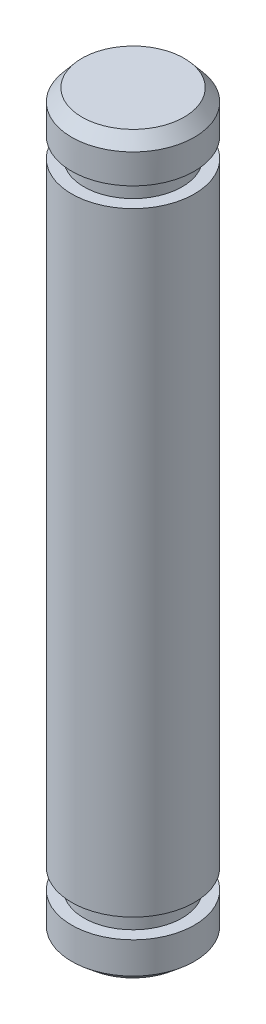
ISO-10303-21;
HEADER;
FILE_DESCRIPTION(('STEP AP214'),'2;1');
FILE_NAME('part.step','',(''),(''),'','','');
FILE_SCHEMA(('AUTOMOTIVE_DESIGN { 1 0 10303 214 1 1 1 1 }'));
ENDSEC;
DATA;
#1=APPLICATION_CONTEXT('core data for automotive mechanical design processes');
#2=APPLICATION_PROTOCOL_DEFINITION('international standard','automotive_design',2000,#1);
#3=PRODUCT_CONTEXT('',#1,'mechanical');
#4=PRODUCT('Part','Part','',(#3));
#5=PRODUCT_RELATED_PRODUCT_CATEGORY('part','',(#4));
#6=PRODUCT_DEFINITION_FORMATION('','',#4);
#7=PRODUCT_DEFINITION_CONTEXT('part definition',#1,'design');
#8=PRODUCT_DEFINITION('design','',#6,#7);
#9=PRODUCT_DEFINITION_SHAPE('','',#8);
#10=(LENGTH_UNIT() NAMED_UNIT(*) SI_UNIT(.MILLI.,.METRE.));
#11=(NAMED_UNIT(*) PLANE_ANGLE_UNIT() SI_UNIT($,.RADIAN.));
#12=(NAMED_UNIT(*) SI_UNIT($,.STERADIAN.) SOLID_ANGLE_UNIT());
#13=UNCERTAINTY_MEASURE_WITH_UNIT(LENGTH_MEASURE(1.E-05),#10,'distance_accuracy_value','');
#14=(GEOMETRIC_REPRESENTATION_CONTEXT(3) GLOBAL_UNCERTAINTY_ASSIGNED_CONTEXT((#13)) GLOBAL_UNIT_ASSIGNED_CONTEXT((#10,
#11,#12)) REPRESENTATION_CONTEXT('',''));
#15=CARTESIAN_POINT('',(0.,0.,0.));
#16=DIRECTION('',(0.,0.,1.));
#17=DIRECTION('',(1.,0.,0.));
#18=AXIS2_PLACEMENT_3D('',#15,#16,#17);
#19=CARTESIAN_POINT('',(0.,15.,0.));
#20=DIRECTION('',(0.,-1.,0.));
#21=DIRECTION('',(0.,0.,-1.));
#22=AXIS2_PLACEMENT_3D('',#19,#20,#21);
#23=CYLINDRICAL_SURFACE('',#22,2.5);
#24=CARTESIAN_POINT('',(0.,14.5,0.));
#25=DIRECTION('',(0.,1.,0.));
#26=DIRECTION('',(0.,0.,1.));
#27=AXIS2_PLACEMENT_3D('',#24,#25,#26);
#28=CIRCLE('',#27,2.5);
#29=CARTESIAN_POINT('',(0.,14.5,2.5));
#30=VERTEX_POINT('',#29);
#31=EDGE_CURVE('E51',#30,#30,#28,.F.);
#32=ORIENTED_EDGE('',*,*,#31,.T.);
#33=EDGE_LOOP('',(#32));
#34=FACE_BOUND('',#33,.T.);
#35=CARTESIAN_POINT('',(0.,13.3,0.));
#36=DIRECTION('',(0.,-1.,0.));
#37=DIRECTION('',(0.,0.,-1.));
#38=AXIS2_PLACEMENT_3D('',#35,#36,#37);
#39=CIRCLE('',#38,2.5);
#40=CARTESIAN_POINT('',(0.,13.3,-2.5));
#41=VERTEX_POINT('',#40);
#42=EDGE_CURVE('E60',#41,#41,#39,.T.);
#43=ORIENTED_EDGE('',*,*,#42,.F.);
#44=EDGE_LOOP('',(#43));
#45=FACE_BOUND('',#44,.T.);
#46=ADVANCED_FACE('F39',(#34,#45),#23,.T.);
#47=CARTESIAN_POINT('',(0.,15.,0.));
#48=DIRECTION('',(0.,1.,0.));
#49=DIRECTION('',(0.,0.,1.));
#50=AXIS2_PLACEMENT_3D('',#47,#48,#49);
#51=PLANE('',#50);
#52=CARTESIAN_POINT('',(0.,15.,0.));
#53=DIRECTION('',(0.,1.,0.));
#54=DIRECTION('',(0.,0.,1.));
#55=AXIS2_PLACEMENT_3D('',#52,#53,#54);
#56=CIRCLE('',#55,2.08045018441136);
#57=CARTESIAN_POINT('',(0.,15.,2.08045018441136));
#58=VERTEX_POINT('',#57);
#59=EDGE_CURVE('E55',#58,#58,#56,.T.);
#60=ORIENTED_EDGE('',*,*,#59,.T.);
#61=EDGE_LOOP('',(#60));
#62=FACE_BOUND('',#61,.T.);
#63=ADVANCED_FACE('F106',(#62),#51,.T.);
#64=CARTESIAN_POINT('',(0.,13.3,0.));
#65=DIRECTION('',(0.,-1.,0.));
#66=DIRECTION('',(0.,0.,-1.));
#67=AXIS2_PLACEMENT_3D('',#64,#65,#66);
#68=PLANE('',#67);
#69=CARTESIAN_POINT('',(0.,13.3,0.));
#70=DIRECTION('',(0.,-1.,0.));
#71=DIRECTION('',(0.,0.,-1.));
#72=AXIS2_PLACEMENT_3D('',#69,#70,#71);
#73=CIRCLE('',#72,2.);
#74=CARTESIAN_POINT('',(0.,13.3,-2.));
#75=VERTEX_POINT('',#74);
#76=EDGE_CURVE('E64',#75,#75,#73,.T.);
#77=ORIENTED_EDGE('',*,*,#76,.F.);
#78=EDGE_LOOP('',(#77));
#79=FACE_BOUND('',#78,.T.);
#80=ORIENTED_EDGE('',*,*,#42,.T.);
#81=EDGE_LOOP('',(#80));
#82=FACE_BOUND('',#81,.T.);
#83=ADVANCED_FACE('F113',(#79,#82),#68,.T.);
#84=CARTESIAN_POINT('',(0.,12.5,0.));
#85=DIRECTION('',(0.,-1.,0.));
#86=DIRECTION('',(0.,0.,-1.));
#87=AXIS2_PLACEMENT_3D('',#84,#85,#86);
#88=PLANE('',#87);
#89=CARTESIAN_POINT('',(0.,12.5,0.));
#90=DIRECTION('',(0.,-1.,0.));
#91=DIRECTION('',(0.,0.,-1.));
#92=AXIS2_PLACEMENT_3D('',#89,#90,#91);
#93=CIRCLE('',#92,2.);
#94=CARTESIAN_POINT('',(0.,12.5,-2.));
#95=VERTEX_POINT('',#94);
#96=EDGE_CURVE('E67',#95,#95,#93,.T.);
#97=ORIENTED_EDGE('',*,*,#96,.T.);
#98=EDGE_LOOP('',(#97));
#99=FACE_BOUND('',#98,.T.);
#100=CARTESIAN_POINT('',(0.,12.5,0.));
#101=DIRECTION('',(0.,-1.,0.));
#102=DIRECTION('',(0.,0.,-1.));
#103=AXIS2_PLACEMENT_3D('',#100,#101,#102);
#104=CIRCLE('',#103,2.5);
#105=CARTESIAN_POINT('',(0.,12.5,-2.5));
#106=VERTEX_POINT('',#105);
#107=EDGE_CURVE('E61',#106,#106,#104,.T.);
#108=ORIENTED_EDGE('',*,*,#107,.F.);
#109=EDGE_LOOP('',(#108));
#110=FACE_BOUND('',#109,.T.);
#111=ADVANCED_FACE('F134',(#99,#110),#88,.F.);
#112=CARTESIAN_POINT('',(0.,13.3,0.));
#113=DIRECTION('',(0.,-1.,0.));
#114=DIRECTION('',(0.,0.,-1.));
#115=AXIS2_PLACEMENT_3D('',#112,#113,#114);
#116=CYLINDRICAL_SURFACE('',#115,2.);
#117=ORIENTED_EDGE('',*,*,#76,.T.);
#118=EDGE_LOOP('',(#117));
#119=FACE_BOUND('',#118,.T.);
#120=ORIENTED_EDGE('',*,*,#96,.F.);
#121=EDGE_LOOP('',(#120));
#122=FACE_BOUND('',#121,.T.);
#123=ADVANCED_FACE('F118',(#119,#122),#116,.T.);
#124=CARTESIAN_POINT('',(0.,-12.5,0.));
#125=DIRECTION('',(0.,-1.,0.));
#126=DIRECTION('',(0.,0.,-1.));
#127=AXIS2_PLACEMENT_3D('',#124,#125,#126);
#128=CIRCLE('',#127,2.5);
#129=CARTESIAN_POINT('',(0.,-12.5,-2.5));
#130=VERTEX_POINT('',#129);
#131=EDGE_CURVE('E73',#130,#130,#128,.T.);
#132=ORIENTED_EDGE('',*,*,#131,.F.);
#133=EDGE_LOOP('',(#132));
#134=FACE_BOUND('',#133,.T.);
#135=ORIENTED_EDGE('',*,*,#107,.T.);
#136=EDGE_LOOP('',(#135));
#137=FACE_BOUND('',#136,.T.);
#138=ADVANCED_FACE('F101',(#134,#137),#23,.T.);
#139=CARTESIAN_POINT('',(0.,-13.3,0.));
#140=DIRECTION('',(0.,1.,0.));
#141=DIRECTION('',(0.,0.,-1.));
#142=AXIS2_PLACEMENT_3D('',#139,#140,#141);
#143=PLANE('',#142);
#144=CARTESIAN_POINT('',(0.,-13.3,0.));
#145=DIRECTION('',(0.,-1.,0.));
#146=DIRECTION('',(0.,0.,-1.));
#147=AXIS2_PLACEMENT_3D('',#144,#145,#146);
#148=CIRCLE('',#147,2.5);
#149=CARTESIAN_POINT('',(0.,-13.3,-2.5));
#150=VERTEX_POINT('',#149);
#151=EDGE_CURVE('E70',#150,#150,#148,.T.);
#152=ORIENTED_EDGE('',*,*,#151,.F.);
#153=EDGE_LOOP('',(#152));
#154=FACE_BOUND('',#153,.T.);
#155=CARTESIAN_POINT('',(0.,-13.3,0.));
#156=DIRECTION('',(0.,-1.,0.));
#157=DIRECTION('',(0.,0.,-1.));
#158=AXIS2_PLACEMENT_3D('',#155,#156,#157);
#159=CIRCLE('',#158,2.);
#160=CARTESIAN_POINT('',(0.,-13.3,-2.));
#161=VERTEX_POINT('',#160);
#162=EDGE_CURVE('E76',#161,#161,#159,.T.);
#163=ORIENTED_EDGE('',*,*,#162,.T.);
#164=EDGE_LOOP('',(#163));
#165=FACE_BOUND('',#164,.T.);
#166=ADVANCED_FACE('F85',(#154,#165),#143,.T.);
#167=CARTESIAN_POINT('',(0.,-12.5,0.));
#168=DIRECTION('',(0.,1.,0.));
#169=DIRECTION('',(0.,0.,-1.));
#170=AXIS2_PLACEMENT_3D('',#167,#168,#169);
#171=PLANE('',#170);
#172=ORIENTED_EDGE('',*,*,#131,.T.);
#173=EDGE_LOOP('',(#172));
#174=FACE_BOUND('',#173,.T.);
#175=CARTESIAN_POINT('',(0.,-12.5,0.));
#176=DIRECTION('',(0.,-1.,0.));
#177=DIRECTION('',(0.,0.,-1.));
#178=AXIS2_PLACEMENT_3D('',#175,#176,#177);
#179=CIRCLE('',#178,2.);
#180=CARTESIAN_POINT('',(0.,-12.5,-2.));
#181=VERTEX_POINT('',#180);
#182=EDGE_CURVE('E79',#181,#181,#179,.T.);
#183=ORIENTED_EDGE('',*,*,#182,.F.);
#184=EDGE_LOOP('',(#183));
#185=FACE_BOUND('',#184,.T.);
#186=ADVANCED_FACE('F91',(#174,#185),#171,.F.);
#187=CARTESIAN_POINT('',(0.,-13.3,0.));
#188=DIRECTION('',(0.,1.,0.));
#189=DIRECTION('',(0.,0.,1.));
#190=AXIS2_PLACEMENT_3D('',#187,#188,#189);
#191=CYLINDRICAL_SURFACE('',#190,2.);
#192=ORIENTED_EDGE('',*,*,#162,.F.);
#193=EDGE_LOOP('',(#192));
#194=FACE_BOUND('',#193,.T.);
#195=ORIENTED_EDGE('',*,*,#182,.T.);
#196=EDGE_LOOP('',(#195));
#197=FACE_BOUND('',#196,.T.);
#198=ADVANCED_FACE('F87',(#194,#197),#191,.T.);
#199=CARTESIAN_POINT('',(0.,-15.,0.));
#200=DIRECTION('',(0.,-1.,0.));
#201=DIRECTION('',(0.,0.,1.));
#202=AXIS2_PLACEMENT_3D('',#199,#200,#201);
#203=PLANE('',#202);
#204=CARTESIAN_POINT('',(0.,-15.,0.));
#205=DIRECTION('',(0.,-1.,0.));
#206=DIRECTION('',(0.,0.,-1.));
#207=AXIS2_PLACEMENT_3D('',#204,#205,#206);
#208=CIRCLE('',#207,1.99999999999999);
#209=CARTESIAN_POINT('',(0.,-15.,-1.99999999999999));
#210=VERTEX_POINT('',#209);
#211=EDGE_CURVE('E10',#210,#210,#208,.T.);
#212=ORIENTED_EDGE('',*,*,#211,.T.);
#213=EDGE_LOOP('',(#212));
#214=FACE_BOUND('',#213,.T.);
#215=ADVANCED_FACE('F90',(#214),#203,.T.);
#216=CARTESIAN_POINT('',(0.,-14.5804501844114,0.));
#217=DIRECTION('',(0.,-1.,0.));
#218=DIRECTION('',(0.,0.,-1.));
#219=AXIS2_PLACEMENT_3D('',#216,#217,#218);
#220=CIRCLE('',#219,2.5);
#221=CARTESIAN_POINT('',(0.,-14.5804501844114,-2.5));
#222=VERTEX_POINT('',#221);
#223=EDGE_CURVE('E47',#222,#222,#220,.F.);
#224=ORIENTED_EDGE('',*,*,#223,.T.);
#225=EDGE_LOOP('',(#224));
#226=FACE_BOUND('',#225,.T.);
#227=ORIENTED_EDGE('',*,*,#151,.T.);
#228=EDGE_LOOP('',(#227));
#229=FACE_BOUND('',#228,.T.);
#230=ADVANCED_FACE('F109',(#226,#229),#23,.T.);
#231=CARTESIAN_POINT('',(0.,15.,0.));
#232=DIRECTION('',(0.,-1.,0.));
#233=DIRECTION('',(0.,0.,-1.));
#234=AXIS2_PLACEMENT_3D('',#231,#232,#233);
#235=CONICAL_SURFACE('',#234,2.08045018441136,0.69813170079773);
#236=ORIENTED_EDGE('',*,*,#31,.F.);
#237=EDGE_LOOP('',(#236));
#238=FACE_BOUND('',#237,.T.);
#239=ORIENTED_EDGE('',*,*,#59,.F.);
#240=EDGE_LOOP('',(#239));
#241=FACE_BOUND('',#240,.T.);
#242=ADVANCED_FACE('F121',(#238,#241),#235,.T.);
#243=CARTESIAN_POINT('',(0.,-14.5804501844114,0.));
#244=DIRECTION('',(0.,1.,0.));
#245=DIRECTION('',(0.,0.,1.));
#246=AXIS2_PLACEMENT_3D('',#243,#244,#245);
#247=CONICAL_SURFACE('',#246,2.5,0.872664625997169);
#248=ORIENTED_EDGE('',*,*,#211,.F.);
#249=EDGE_LOOP('',(#248));
#250=FACE_BOUND('',#249,.T.);
#251=ORIENTED_EDGE('',*,*,#223,.F.);
#252=EDGE_LOOP('',(#251));
#253=FACE_BOUND('',#252,.T.);
#254=ADVANCED_FACE('F42',(#250,#253),#247,.T.);
#255=CLOSED_SHELL('',(#46,#63,#83,#111,#123,#138,#166,#186,#198,#215,#230,#242,#254));
#256=MANIFOLD_SOLID_BREP('B2',#255);
#257=ADVANCED_BREP_SHAPE_REPRESENTATION('',(#18,#256),#14);
#258=SHAPE_DEFINITION_REPRESENTATION(#9,#257);
ENDSEC;
END-ISO-10303-21;
